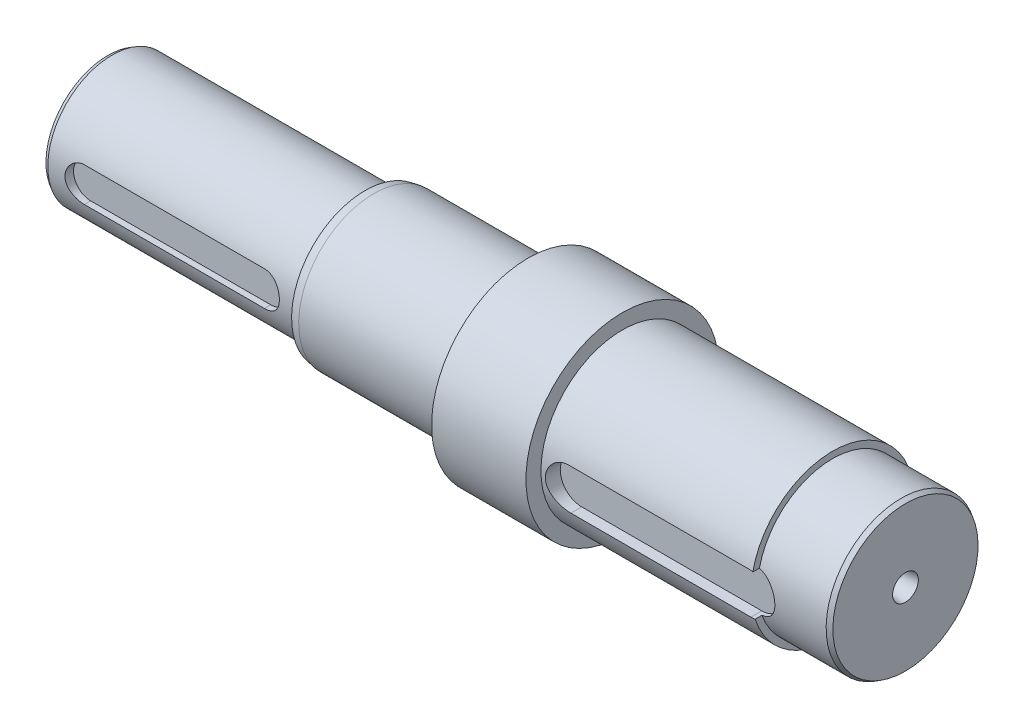
ISO-10303-21;
HEADER;
FILE_DESCRIPTION(('STEP AP214'),'2;1');
FILE_NAME('part.step','',(''),(''),'','','');
FILE_SCHEMA(('AUTOMOTIVE_DESIGN { 1 0 10303 214 1 1 1 1 }'));
ENDSEC;
DATA;
#1=APPLICATION_CONTEXT('core data for automotive mechanical design processes');
#2=APPLICATION_PROTOCOL_DEFINITION('international standard','automotive_design',2000,#1);
#3=PRODUCT_CONTEXT('',#1,'mechanical');
#4=PRODUCT('Part','Part','',(#3));
#5=PRODUCT_RELATED_PRODUCT_CATEGORY('part','',(#4));
#6=PRODUCT_DEFINITION_FORMATION('','',#4);
#7=PRODUCT_DEFINITION_CONTEXT('part definition',#1,'design');
#8=PRODUCT_DEFINITION('design','',#6,#7);
#9=PRODUCT_DEFINITION_SHAPE('','',#8);
#10=(LENGTH_UNIT() NAMED_UNIT(*) SI_UNIT(.MILLI.,.METRE.));
#11=(NAMED_UNIT(*) PLANE_ANGLE_UNIT() SI_UNIT($,.RADIAN.));
#12=(NAMED_UNIT(*) SI_UNIT($,.STERADIAN.) SOLID_ANGLE_UNIT());
#13=UNCERTAINTY_MEASURE_WITH_UNIT(LENGTH_MEASURE(1.E-05),#10,'distance_accuracy_value','');
#14=(GEOMETRIC_REPRESENTATION_CONTEXT(3) GLOBAL_UNCERTAINTY_ASSIGNED_CONTEXT((#13)) GLOBAL_UNIT_ASSIGNED_CONTEXT((#10,
#11,#12)) REPRESENTATION_CONTEXT('',''));
#15=CARTESIAN_POINT('',(0.,0.,0.));
#16=DIRECTION('',(0.,0.,1.));
#17=DIRECTION('',(1.,0.,0.));
#18=AXIS2_PLACEMENT_3D('',#15,#16,#17);
#19=CARTESIAN_POINT('',(-98.6947443181818,0.,0.));
#20=DIRECTION('',(-1.,0.,0.));
#21=DIRECTION('',(0.,-1.,0.));
#22=AXIS2_PLACEMENT_3D('',#19,#20,#21);
#23=CYLINDRICAL_SURFACE('',#22,19.);
#24=CARTESIAN_POINT('',(21.3052556818182,0.,0.));
#25=DIRECTION('',(-1.,0.,0.));
#26=DIRECTION('',(0.,-1.,0.));
#27=AXIS2_PLACEMENT_3D('',#24,#25,#26);
#28=CIRCLE('',#27,19.);
#29=CARTESIAN_POINT('',(21.3052556818182,-19.,0.));
#30=VERTEX_POINT('',#29);
#31=EDGE_CURVE('E221',#30,#30,#28,.T.);
#32=ORIENTED_EDGE('',*,*,#31,.F.);
#33=EDGE_LOOP('',(#32));
#34=FACE_BOUND('',#33,.T.);
#35=CARTESIAN_POINT('',(69.3052556818182,-6.,18.0277563773199));
#36=CARTESIAN_POINT('',(69.3893336137772,-6.00000257579785,18.0277538686261));
#37=CARTESIAN_POINT('',(69.4734109502124,-5.99787928288462,18.0284621960467));
#38=CARTESIAN_POINT('',(69.6410941112768,-5.98941216393533,18.0312777321598));
#39=CARTESIAN_POINT('',(69.7247005969589,-5.98308013219844,18.0333810316365));
#40=CARTESIAN_POINT('',(69.8914432672904,-5.96622654081709,18.0389639161815));
#41=CARTESIAN_POINT('',(69.9745794539085,-5.95570499872395,18.042443495484));
#42=CARTESIAN_POINT('',(70.1403855788294,-5.93047825095381,18.0507504291519));
#43=CARTESIAN_POINT('',(70.2230535613351,-5.9157614200859,18.0555815278892));
#44=CARTESIAN_POINT('',(70.3052556818182,-5.89897948556636,18.061064227472));
#45=B_SPLINE_CURVE_WITH_KNOTS('',3,(#35,#36,#37,#38,#39,#40,#41,#42,#43,#44),.UNSPECIFIED.,.F.,
.F.,(4,2,2,2,4),(0.,0.25220308202243,0.503702369437238,0.755200603245461,1.00740263101469),.UNSPECIFIED.);
#46=CARTESIAN_POINT('',(69.3052556818182,-6.,18.0277563773199));
#47=VERTEX_POINT('',#46);
#48=CARTESIAN_POINT('',(70.3052556818182,-5.89897948556636,18.061064227472));
#49=VERTEX_POINT('',#48);
#50=EDGE_CURVE('E157',#47,#49,#45,.T.);
#51=ORIENTED_EDGE('',*,*,#50,.F.);
#52=DIRECTION('',(-1.,0.,0.));
#53=VECTOR('',#52,1.);
#54=CARTESIAN_POINT('',(-98.6947443181818,-6.00000000000002,18.0277563773199));
#55=LINE('',#54,#53);
#56=CARTESIAN_POINT('',(27.3052556818182,-6.00000000000001,18.0277563773199));
#57=VERTEX_POINT('',#56);
#58=EDGE_CURVE('E11',#57,#47,#55,.F.);
#59=ORIENTED_EDGE('',*,*,#58,.F.);
#60=CARTESIAN_POINT('',(27.3052556818182,4.,18.5741756210067));
#61=CARTESIAN_POINT('',(27.1661588355617,4.00001685790611,18.5741600112581));
#62=CARTESIAN_POINT('',(27.0270668492959,3.99419636407822,18.5754250917841));
#63=CARTESIAN_POINT('',(26.7499123739715,3.97100429542883,18.5804032327995));
#64=CARTESIAN_POINT('',(26.6118497420993,3.95363435432447,18.5841159470605));
#65=CARTESIAN_POINT('',(26.3379596925412,3.90750498724634,18.5938679730531));
#66=CARTESIAN_POINT('',(26.2021289664827,3.8787643764187,18.599903440857));
#67=CARTESIAN_POINT('',(25.9334294927728,3.81012658803463,18.6140852696638));
#68=CARTESIAN_POINT('',(25.8005607696846,3.77022931799554,18.6222316481648));
#69=CARTESIAN_POINT('',(25.5387309163093,3.67959194067003,18.6403523096814));
#70=CARTESIAN_POINT('',(25.4097691111046,3.62885371848746,18.6503262748598));
#71=CARTESIAN_POINT('',(25.1565561159239,3.5168861911782,18.6717637141105));
#72=CARTESIAN_POINT('',(25.0323066930508,3.45565299711485,18.6832277399464));
#73=CARTESIAN_POINT('',(24.7894218707744,3.32316009447191,18.70724822748));
#74=CARTESIAN_POINT('',(24.6707852437518,3.25190259206308,18.7198044485737));
#75=CARTESIAN_POINT('',(24.4398311747954,3.09981313561822,18.7455890141292));
#76=CARTESIAN_POINT('',(24.3275161199046,3.01897760019468,18.7588176089403));
#77=CARTESIAN_POINT('',(24.1084591726865,2.84709562934897,18.7856784758374));
#78=CARTESIAN_POINT('',(24.0018174746677,2.75592194268055,18.7993138071927));
#79=CARTESIAN_POINT('',(23.7965145392649,2.5648848783138,18.8263292407875));
#80=CARTESIAN_POINT('',(23.697856284904,2.46501828116562,18.83970924621));
#81=CARTESIAN_POINT('',(23.5092625617196,2.25731607832725,18.8657221689228));
#82=CARTESIAN_POINT('',(23.4193249713508,2.14948242215148,18.8783552676255));
#83=CARTESIAN_POINT('',(23.2487455886166,1.92650589932029,18.9024112572045));
#84=CARTESIAN_POINT('',(23.1681072084091,1.81136037360076,18.9138337037327));
#85=CARTESIAN_POINT('',(23.016444233856,1.57410151156793,18.9350585921822));
#86=CARTESIAN_POINT('',(22.9454595777229,1.45196203272837,18.9448543391546));
#87=CARTESIAN_POINT('',(22.8139998809385,1.20194817032521,18.9623581755525));
#88=CARTESIAN_POINT('',(22.7535287862505,1.07407165608613,18.9700654817452));
#89=CARTESIAN_POINT('',(22.6436309936326,0.813620796065558,18.983018941704));
#90=CARTESIAN_POINT('',(22.5941980053708,0.681049176070755,18.9882664991014));
#91=CARTESIAN_POINT('',(22.5067077954172,0.412072555065769,18.9960076796387));
#92=CARTESIAN_POINT('',(22.4686546625751,0.275666195423424,18.9985003137834));
#93=CARTESIAN_POINT('',(22.4050086885003,0.00332532392624367,19.0004756607683));
#94=CARTESIAN_POINT('',(22.3791441316395,-0.132544994004049,19.0000277067871));
#95=CARTESIAN_POINT('',(22.3387462777944,-0.405931594277556,18.996156878127));
#96=CARTESIAN_POINT('',(22.3242171152517,-0.543448458626753,18.9927329189496));
#97=CARTESIAN_POINT('',(22.2978459731731,-0.956826743535852,18.9778837397496));
#98=CARTESIAN_POINT('',(22.3031459123931,-1.23383590845484,18.9618839438189));
#99=CARTESIAN_POINT('',(22.3587037515602,-1.77816298014791,18.9185578656315));
#100=CARTESIAN_POINT('',(22.4083161776923,-2.04556288447772,18.8913972134913));
#101=CARTESIAN_POINT('',(22.5497175910413,-2.56780204839454,18.8275219650554));
#102=CARTESIAN_POINT('',(22.6415110524545,-2.8226399723403,18.7908063554322));
#103=CARTESIAN_POINT('',(22.8667906298894,-3.31859365521029,18.7096640756035));
#104=CARTESIAN_POINT('',(23.0011367637862,-3.55929262001249,18.6650876058504));
#105=CARTESIAN_POINT('',(23.3071859900335,-4.01508306300515,18.5723778427754));
#106=CARTESIAN_POINT('',(23.4788971396255,-4.23016900260429,18.52424378379));
#107=CARTESIAN_POINT('',(23.7641729188379,-4.53283270056144,18.4516871772259));
#108=CARTESIAN_POINT('',(23.8658116835602,-4.63185524122231,18.4270310315437));
#109=CARTESIAN_POINT('',(24.0772211521856,-4.8209784548006,18.3784568083451));
#110=CARTESIAN_POINT('',(24.1869889260224,-4.91108231531848,18.3545384692507));
#111=CARTESIAN_POINT('',(24.4140416382409,-5.08179830075215,18.30800831968));
#112=CARTESIAN_POINT('',(24.5313315152465,-5.16240408913632,18.2853973864897));
#113=CARTESIAN_POINT('',(24.7725649691084,-5.31343442569882,18.2420827813708));
#114=CARTESIAN_POINT('',(24.8965057893733,-5.38386314790984,18.2213783287874));
#115=CARTESIAN_POINT('',(25.1500143580722,-5.51388849241055,18.1824540132713));
#116=CARTESIAN_POINT('',(25.2795708081468,-5.57350571804406,18.1642294413722));
#117=CARTESIAN_POINT('',(25.5435799333096,-5.68154152780717,18.1307276669599));
#118=CARTESIAN_POINT('',(25.6780304925471,-5.72996488631752,18.1154492083404));
#119=CARTESIAN_POINT('',(25.9507311381165,-5.81514740001102,18.0882851610722));
#120=CARTESIAN_POINT('',(26.0889764023809,-5.8519206757604,18.0763954668159));
#121=CARTESIAN_POINT('',(26.3683103817105,-5.91350936696553,18.0563411568545));
#122=CARTESIAN_POINT('',(26.5093976166186,-5.93833084755597,18.0481746518681));
#123=CARTESIAN_POINT('',(26.7597372799549,-5.97135409342011,18.0372714846592));
#124=CARTESIAN_POINT('',(26.8686256574078,-5.98209833155677,18.0337073612855));
#125=CARTESIAN_POINT('',(27.0867575404689,-5.99641894645898,18.0289481698325));
#126=CARTESIAN_POINT('',(27.1960002545829,-6.00000619483549,18.027749508599));
#127=CARTESIAN_POINT('',(27.3052556818182,-6.00000000000001,18.0277563773199));
#128=B_SPLINE_CURVE_WITH_KNOTS('',3,(#60,#61,#62,#63,#64,#65,#66,#67,#68,#69,#70,#71,#72,#73,
#74,#75,#76,#77,#78,#79,#80,#81,#82,#83,#84,#85,#86,#87,#88,#89,#90,#91,#92,#93,#94,#95,#96,#97,
#98,#99,#100,#101,#102,#103,#104,#105,#106,#107,#108,#109,#110,#111,#112,#113,#114,#115,#116,
#117,#118,#119,#120,#121,#122,#123,#124,#125,#126,#127),.UNSPECIFIED.,.F.,.F.,(4,2,2,2,2,2,2,2,
2,2,2,2,2,2,2,2,2,2,2,2,2,2,2,2,2,2,2,2,2,2,2,2,2,4),(0.,0.417155703360219,0.83425241086853,
1.25066181223549,1.66707466551285,2.08341516872838,2.49991028277247,2.91631387668676,
3.33287366519065,3.75527275642223,4.17782895570663,4.60028209709407,5.02288975922486,
5.44719579535117,5.87166074038484,6.29588317293423,6.72025784849242,7.13466315414948,
7.54921953832579,8.37735934129406,9.19362936925819,10.0099860000209,10.8440253568034,
11.6782447410098,12.109905715731,12.541411850378,12.9732042488684,13.404819045831,
13.8356024720572,14.2662018211839,14.6962772446434,15.1261341886513,15.4543095697214,
15.7819860651025),.UNSPECIFIED.);
#129=CARTESIAN_POINT('',(27.3052556818182,4.,18.5741756210067));
#130=VERTEX_POINT('',#129);
#131=EDGE_CURVE('E47',#130,#57,#128,.T.);
#132=ORIENTED_EDGE('',*,*,#131,.F.);
#133=DIRECTION('',(-1.,0.,0.));
#134=VECTOR('',#133,1.);
#135=CARTESIAN_POINT('',(-98.6947443181818,4.,18.5741756210067));
#136=LINE('',#135,#134);
#137=CARTESIAN_POINT('',(69.3052556818182,4.,18.5741756210067));
#138=VERTEX_POINT('',#137);
#139=EDGE_CURVE('E193',#138,#130,#136,.T.);
#140=ORIENTED_EDGE('',*,*,#139,.F.);
#141=CARTESIAN_POINT('',(70.3052556818182,3.89897948556636,18.5956435481844));
#142=CARTESIAN_POINT('',(70.2229914190767,3.91577369985261,18.5921208784416));
#143=CARTESIAN_POINT('',(70.1402860580984,3.93049531779535,18.5890118170965));
#144=CARTESIAN_POINT('',(69.9744308025277,3.9557256942336,18.5836598394075));
#145=CARTESIAN_POINT('',(69.8912826544848,3.96624545591318,18.5814146614306));
#146=CARTESIAN_POINT('',(69.7245432999553,3.98309334490757,18.5778104735184));
#147=CARTESIAN_POINT('',(69.6409520925734,3.989421463748,18.5764514653746));
#148=CARTESIAN_POINT('',(69.4733263351619,3.9978814165179,18.5746318650875));
#149=CARTESIAN_POINT('',(69.3892911972997,4.00000211524297,18.5741736569977));
#150=CARTESIAN_POINT('',(69.3052556818182,4.,18.5741756210067));
#151=B_SPLINE_CURVE_WITH_KNOTS('',3,(#141,#142,#143,#144,#145,#146,#147,#148,#149,#150),
.UNSPECIFIED.,.F.,.F.,(4,2,2,2,4),(0.,0.25207744543739,0.503490391583757,0.754903846018369,
1.00698179920828),.UNSPECIFIED.);
#152=CARTESIAN_POINT('',(70.3052556818182,3.89897948556635,18.5956435481844));
#153=VERTEX_POINT('',#152);
#154=EDGE_CURVE('E165',#153,#138,#151,.T.);
#155=ORIENTED_EDGE('',*,*,#154,.F.);
#156=CARTESIAN_POINT('',(70.3052556818182,0.,0.));
#157=DIRECTION('',(-1.,0.,0.));
#158=DIRECTION('',(0.,-1.,0.));
#159=AXIS2_PLACEMENT_3D('',#156,#157,#158);
#160=CIRCLE('',#159,19.);
#161=EDGE_CURVE('E216',#153,#49,#160,.T.);
#162=ORIENTED_EDGE('',*,*,#161,.T.);
#163=EDGE_LOOP('',(#51,#59,#132,#140,#155,#162));
#164=FACE_BOUND('',#163,.T.);
#165=ADVANCED_FACE('F39',(#34,#164),#23,.T.);
#166=CARTESIAN_POINT('',(70.3052556818182,19.,0.));
#167=DIRECTION('',(-1.,0.,0.));
#168=DIRECTION('',(0.,-1.,0.));
#169=AXIS2_PLACEMENT_3D('',#166,#167,#168);
#170=PLANE('',#169);
#171=DIRECTION('',(0.,0.,-1.));
#172=VECTOR('',#171,1.);
#173=CARTESIAN_POINT('',(70.3052556818182,3.89897948556635,40.5));
#174=LINE('',#173,#172);
#175=CARTESIAN_POINT('',(70.3052556818182,3.89897948556636,17.060127753658));
#176=VERTEX_POINT('',#175);
#177=EDGE_CURVE('E155',#176,#153,#174,.F.);
#178=ORIENTED_EDGE('',*,*,#177,.F.);
#179=CARTESIAN_POINT('',(70.3052556818182,0.,0.));
#180=DIRECTION('',(-1.,0.,0.));
#181=DIRECTION('',(0.,-1.,0.));
#182=AXIS2_PLACEMENT_3D('',#179,#180,#181);
#183=CIRCLE('',#182,17.5);
#184=CARTESIAN_POINT('',(70.3052556818182,-5.89897948556636,16.4758016809158));
#185=VERTEX_POINT('',#184);
#186=EDGE_CURVE('E214',#176,#185,#183,.T.);
#187=ORIENTED_EDGE('',*,*,#186,.T.);
#188=DIRECTION('',(0.,0.,-1.));
#189=VECTOR('',#188,1.);
#190=CARTESIAN_POINT('',(70.3052556818182,-5.89897948556636,40.5));
#191=LINE('',#190,#189);
#192=EDGE_CURVE('E54',#49,#185,#191,.T.);
#193=ORIENTED_EDGE('',*,*,#192,.F.);
#194=ORIENTED_EDGE('',*,*,#161,.F.);
#195=EDGE_LOOP('',(#178,#187,#193,#194));
#196=FACE_BOUND('',#195,.T.);
#197=ADVANCED_FACE('F200',(#196),#170,.F.);
#198=CARTESIAN_POINT('',(-98.6947443181818,0.,0.));
#199=DIRECTION('',(-1.,0.,0.));
#200=DIRECTION('',(0.,-1.,0.));
#201=AXIS2_PLACEMENT_3D('',#198,#199,#200);
#202=CYLINDRICAL_SURFACE('',#201,17.5);
#203=CARTESIAN_POINT('',(86.3052556818182,0.,0.));
#204=DIRECTION('',(-1.,0.,0.));
#205=DIRECTION('',(0.,-1.,0.));
#206=AXIS2_PLACEMENT_3D('',#203,#204,#205);
#207=CIRCLE('',#206,17.5);
#208=CARTESIAN_POINT('',(86.3052556818182,-17.5,0.));
#209=VERTEX_POINT('',#208);
#210=EDGE_CURVE('E219',#209,#209,#207,.T.);
#211=ORIENTED_EDGE('',*,*,#210,.T.);
#212=EDGE_LOOP('',(#211));
#213=FACE_BOUND('',#212,.T.);
#214=CARTESIAN_POINT('',(70.3052556818182,-5.89897948556636,16.4758016809158));
#215=CARTESIAN_POINT('',(70.4422014235865,-5.87104158280583,16.4857938368412));
#216=CARTESIAN_POINT('',(70.5778062090224,-5.83736458335083,16.4977819742232));
#217=CARTESIAN_POINT('',(70.8453513704898,-5.7589378971628,16.525327642576));
#218=CARTESIAN_POINT('',(70.9772930806551,-5.71419230217784,16.5408838543758));
#219=CARTESIAN_POINT('',(71.2363092666309,-5.61413742281593,16.5751084425126));
#220=CARTESIAN_POINT('',(71.3633950414352,-5.5588547133859,16.5937689749038));
#221=CARTESIAN_POINT('',(71.6121933669906,-5.4381504770382,16.6337177920808));
#222=CARTESIAN_POINT('',(71.7339055204764,-5.37272820212226,16.6550062707072));
#223=CARTESIAN_POINT('',(72.0895755790142,-5.1621247490769,16.7219658519324));
#224=CARTESIAN_POINT('',(72.3145591255714,-5.00241557860577,16.770799283362));
#225=CARTESIAN_POINT('',(72.7348045225255,-4.64880533293169,16.8722376613124));
#226=CARTESIAN_POINT('',(72.9300488435057,-4.45488423614819,16.9248448055373));
#227=CARTESIAN_POINT('',(73.2925231593311,-4.03022329245111,17.0310530666383));
#228=CARTESIAN_POINT('',(73.4585377539331,-3.79843473009262,17.0846248041592));
#229=CARTESIAN_POINT('',(73.7492392435792,-3.30911102326949,17.1861031334646));
#230=CARTESIAN_POINT('',(73.8739283812524,-3.05157727691915,17.2340100325749));
#231=CARTESIAN_POINT('',(74.0776626460808,-2.51832911187605,17.3199498548401));
#232=CARTESIAN_POINT('',(74.1568415086837,-2.24267064225071,17.3580115257764));
#233=CARTESIAN_POINT('',(74.2670006855671,-1.6804877095761,17.4214195883933));
#234=CARTESIAN_POINT('',(74.2979959293384,-1.39396664045549,17.4467699169797));
#235=CARTESIAN_POINT('',(74.3099951294051,-0.830840888962415,17.4824494802286));
#236=CARTESIAN_POINT('',(74.2930075811567,-0.554314427511014,17.4933549532067));
#237=CARTESIAN_POINT('',(74.2135697668175,-0.00767373769400769,17.5021328889064));
#238=CARTESIAN_POINT('',(74.1511233239707,0.262441027943896,17.5000064475437));
#239=CARTESIAN_POINT('',(73.9842642423364,0.78333623944141,17.4843667931143));
#240=CARTESIAN_POINT('',(73.8806671966871,1.03438564208787,17.4710695820959));
#241=CARTESIAN_POINT('',(73.6345829557875,1.51595798259878,17.4358888564706));
#242=CARTESIAN_POINT('',(73.4920944205833,1.74648021286406,17.4140050460126));
#243=CARTESIAN_POINT('',(73.1687234266794,2.18585505298461,17.3643900418286));
#244=CARTESIAN_POINT('',(72.9870772578565,2.39413118215712,17.3365426208009));
#245=CARTESIAN_POINT('',(72.5919137866481,2.778057524818,17.2791830555566));
#246=CARTESIAN_POINT('',(72.3783767818507,2.95368741756846,17.2496698892911));
#247=CARTESIAN_POINT('',(72.0357784325211,3.19097729667391,17.2068113776963));
#248=CARTESIAN_POINT('',(71.9161943452522,3.26649934856451,17.1925891162046));
#249=CARTESIAN_POINT('',(71.6709771084046,3.40718812407574,17.1652614498825));
#250=CARTESIAN_POINT('',(71.545346276576,3.47235877489899,17.152155622369));
#251=CARTESIAN_POINT('',(71.2891102146192,3.5917621185911,17.1275496855757));
#252=CARTESIAN_POINT('',(71.1585136050618,3.64601282245325,17.1160469420271));
#253=CARTESIAN_POINT('',(70.8931074906153,3.74327702477922,17.095038915515));
#254=CARTESIAN_POINT('',(70.7583006648387,3.786297512641,17.0855323908804));
#255=CARTESIAN_POINT('',(70.5695296425506,3.83782610040693,17.0739948910885));
#256=CARTESIAN_POINT('',(70.5169333519532,3.85126647565092,17.0709669665732));
#257=CARTESIAN_POINT('',(70.4113733984023,3.87641693581377,17.0652734401522));
#258=CARTESIAN_POINT('',(70.3584102279266,3.88812899432618,17.0626074252591));
#259=CARTESIAN_POINT('',(70.3052556818182,3.89897948556636,17.060127753658));
#260=B_SPLINE_CURVE_WITH_KNOTS('',3,(#214,#215,#216,#217,#218,#219,#220,#221,#222,#223,#224,
#225,#226,#227,#228,#229,#230,#231,#232,#233,#234,#235,#236,#237,#238,#239,#240,#241,#242,#243,
#244,#245,#246,#247,#248,#249,#250,#251,#252,#253,#254,#255,#256,#257,#258,#259),.UNSPECIFIED.,
.F.,.F.,(4,2,2,2,2,2,2,2,2,2,2,2,2,2,2,2,2,2,2,2,2,2,4),(0.,0.42019614302979,0.8402371829081,
1.25923255684747,1.67825885490482,2.51473419832261,3.35170069945859,4.21787513515948,
5.08400255804034,5.94757161231429,6.81087303999669,7.63857975106979,8.46621685729873,
9.27820927821311,10.0902296787685,10.9198119088954,11.7499087980923,12.1759330899275,
12.6017953649769,13.026949375328,13.4518381464546,13.614927128986,13.7778284119125),.UNSPECIFIED.);
#261=EDGE_CURVE('E185',#185,#176,#260,.T.);
#262=ORIENTED_EDGE('',*,*,#261,.F.);
#263=ORIENTED_EDGE('',*,*,#186,.F.);
#264=EDGE_LOOP('',(#262,#263));
#265=FACE_BOUND('',#264,.T.);
#266=ADVANCED_FACE('F196',(#213,#265),#202,.T.);
#267=CARTESIAN_POINT('',(-98.6947443181818,0.,0.));
#268=DIRECTION('',(1.,0.,0.));
#269=DIRECTION('',(0.,1.,0.));
#270=AXIS2_PLACEMENT_3D('',#267,#268,#269);
#271=PLANE('',#270);
#272=CARTESIAN_POINT('',(-98.6947443181818,0.,0.));
#273=DIRECTION('',(-1.,0.,0.));
#274=DIRECTION('',(0.,0.,1.));
#275=AXIS2_PLACEMENT_3D('',#272,#273,#274);
#276=CIRCLE('',#275,3.);
#277=CARTESIAN_POINT('',(-98.6947443181818,0.,3.));
#278=VERTEX_POINT('',#277);
#279=EDGE_CURVE('E143',#278,#278,#276,.T.);
#280=ORIENTED_EDGE('',*,*,#279,.F.);
#281=EDGE_LOOP('',(#280));
#282=FACE_BOUND('',#281,.T.);
#283=CARTESIAN_POINT('',(-98.6947443181818,0.,0.));
#284=DIRECTION('',(-1.,0.,0.));
#285=DIRECTION('',(0.,-1.,0.));
#286=AXIS2_PLACEMENT_3D('',#283,#284,#285);
#287=CIRCLE('',#286,14.4226497308104);
#288=CARTESIAN_POINT('',(-98.6947443181818,-14.4226497308104,0.));
#289=VERTEX_POINT('',#288);
#290=EDGE_CURVE('E251',#289,#289,#287,.T.);
#291=ORIENTED_EDGE('',*,*,#290,.T.);
#292=EDGE_LOOP('',(#291));
#293=FACE_BOUND('',#292,.T.);
#294=ADVANCED_FACE('F41',(#282,#293),#271,.F.);
#295=CARTESIAN_POINT('',(-97.6947443181818,0.,0.));
#296=DIRECTION('',(1.,0.,0.));
#297=DIRECTION('',(0.,1.,0.));
#298=AXIS2_PLACEMENT_3D('',#295,#296,#297);
#299=CONICAL_SURFACE('',#298,15.,0.523598775598294);
#300=ORIENTED_EDGE('',*,*,#290,.F.);
#301=EDGE_LOOP('',(#300));
#302=FACE_BOUND('',#301,.T.);
#303=CARTESIAN_POINT('',(-97.6947443181818,0.,0.));
#304=DIRECTION('',(-1.,0.,0.));
#305=DIRECTION('',(0.,-1.,0.));
#306=AXIS2_PLACEMENT_3D('',#303,#304,#305);
#307=CIRCLE('',#306,15.);
#308=CARTESIAN_POINT('',(-97.6947443181818,-15.,0.));
#309=VERTEX_POINT('',#308);
#310=EDGE_CURVE('E248',#309,#309,#307,.T.);
#311=ORIENTED_EDGE('',*,*,#310,.T.);
#312=EDGE_LOOP('',(#311));
#313=FACE_BOUND('',#312,.T.);
#314=ADVANCED_FACE('F524',(#302,#313),#299,.T.);
#315=CARTESIAN_POINT('',(-98.6947443181818,0.,0.));
#316=DIRECTION('',(-1.,0.,0.));
#317=DIRECTION('',(0.,-1.,0.));
#318=AXIS2_PLACEMENT_3D('',#315,#316,#317);
#319=CYLINDRICAL_SURFACE('',#318,15.);
#320=DIRECTION('',(-1.,0.,0.));
#321=VECTOR('',#320,1.);
#322=CARTESIAN_POINT('',(-98.6947443181818,4.05,14.4429048324774));
#323=LINE('',#322,#321);
#324=CARTESIAN_POINT('',(-89.6949943244321,4.05,14.4429048324774));
#325=VERTEX_POINT('',#324);
#326=CARTESIAN_POINT('',(-47.6949943244321,4.05,14.4429048324774));
#327=VERTEX_POINT('',#326);
#328=EDGE_CURVE('E194',#325,#327,#323,.F.);
#329=ORIENTED_EDGE('',*,*,#328,.T.);
#330=CARTESIAN_POINT('',(-47.6949943244321,4.05,14.4429048324774));
#331=CARTESIAN_POINT('',(-47.5846997477293,4.05001314932835,14.4428914531416));
#332=CARTESIAN_POINT('',(-47.4744131914482,4.04543838343753,14.4441837348867));
#333=CARTESIAN_POINT('',(-47.2546709190222,4.02721520252342,14.4492803029022));
#334=CARTESIAN_POINT('',(-47.1452150501282,4.0135684986714,14.4530841154405));
#335=CARTESIAN_POINT('',(-46.928143794945,3.97734310954755,14.4630935668311));
#336=CARTESIAN_POINT('',(-46.8205249144209,3.95478397510367,14.4692939477908));
#337=CARTESIAN_POINT('',(-46.6076726039614,3.90094781248267,14.4839006615935));
#338=CARTESIAN_POINT('',(-46.5024392173865,3.86967062597704,14.4923070344993));
#339=CARTESIAN_POINT('',(-46.1914524801284,3.76312039874318,14.520481905317));
#340=CARTESIAN_POINT('',(-45.9901734684474,3.67508839827319,14.5432179927643));
#341=CARTESIAN_POINT('',(-45.6052713213284,3.46774036351877,14.5940433272455));
#342=CARTESIAN_POINT('',(-45.4216542257129,3.34841367904936,14.6221343957923));
#343=CARTESIAN_POINT('',(-45.0725287236542,3.07860062797752,14.6813380085674));
#344=CARTESIAN_POINT('',(-44.9075328855361,2.92746174248031,14.712505117145));
#345=CARTESIAN_POINT('',(-44.6048952822841,2.59971826180473,14.7739372114001));
#346=CARTESIAN_POINT('',(-44.4672580500431,2.42310945500931,14.80420204688));
#347=CARTESIAN_POINT('',(-44.2210220173583,2.04577090213696,14.8610826567499));
#348=CARTESIAN_POINT('',(-44.1129513896761,1.84468497104367,14.8876283797533));
#349=CARTESIAN_POINT('',(-43.9323561485762,1.42638100006763,14.933507203252));
#350=CARTESIAN_POINT('',(-43.8598239355859,1.20916642060275,14.9528418455612));
#351=CARTESIAN_POINT('',(-43.7539982774669,0.769998987770738,14.9818024753968));
#352=CARTESIAN_POINT('',(-43.7198496378767,0.548266373593781,14.991639340818));
#353=CARTESIAN_POINT('',(-43.6890865455694,0.102007694107047,15.0013122252984));
#354=CARTESIAN_POINT('',(-43.6924664654076,-0.12251794734203,15.0011497437529));
#355=CARTESIAN_POINT('',(-43.7360637150396,-0.561836272125196,14.9910440763006));
#356=CARTESIAN_POINT('',(-43.7753264864697,-0.776730516666958,14.9813538441343));
#357=CARTESIAN_POINT('',(-43.8880483225557,-1.19677824163868,14.9536634965668));
#358=CARTESIAN_POINT('',(-43.961508873251,-1.40193129834548,14.9356630200504));
#359=CARTESIAN_POINT('',(-44.1411856212776,-1.79887891896252,14.8930952179381));
#360=CARTESIAN_POINT('',(-44.2476960007313,-1.99053373981751,14.8684691899504));
#361=CARTESIAN_POINT('',(-44.4902312748503,-2.35357241200658,14.815343600434));
#362=CARTESIAN_POINT('',(-44.6262612454268,-2.52495276929401,14.7868433730496));
#363=CARTESIAN_POINT('',(-44.928802052102,-2.84804378152094,14.7280839415426));
#364=CARTESIAN_POINT('',(-45.0961114589975,-2.99900125281122,14.6977976063593));
#365=CARTESIAN_POINT('',(-45.4541195482725,-3.27098665386637,14.6396741951286));
#366=CARTESIAN_POINT('',(-45.6448247074989,-3.39200626758043,14.6118378009988));
#367=CARTESIAN_POINT('',(-45.9450614658603,-3.5487034743883,14.5742788266461));
#368=CARTESIAN_POINT('',(-46.0479550213561,-3.59694321455739,14.5624185516133));
#369=CARTESIAN_POINT('',(-46.257624424596,-3.68454849690777,14.5405001757957));
#370=CARTESIAN_POINT('',(-46.364398696013,-3.72391759653176,14.5304413528977));
#371=CARTESIAN_POINT('',(-46.5809578932996,-3.79341619513013,14.5124526603179));
#372=CARTESIAN_POINT('',(-46.690739597394,-3.82355519045504,14.5045206035759));
#373=CARTESIAN_POINT('',(-46.9125692383247,-3.87437884692583,14.4910275298853));
#374=CARTESIAN_POINT('',(-47.0246160990592,-3.89506789211278,14.4854654135495));
#375=CARTESIAN_POINT('',(-47.2297426975407,-3.9239452580717,14.4776670002862));
#376=CARTESIAN_POINT('',(-47.3225869034219,-3.93371790835049,14.4750110835216));
#377=CARTESIAN_POINT('',(-47.5086163217992,-3.94674315810015,14.4714625099462));
#378=CARTESIAN_POINT('',(-47.6018007575161,-3.95000609830929,14.4705670566548));
#379=CARTESIAN_POINT('',(-47.6949943244321,-3.95,14.4705735891844));
#380=B_SPLINE_CURVE_WITH_KNOTS('',3,(#330,#331,#332,#333,#334,#335,#336,#337,#338,#339,#340,
#341,#342,#343,#344,#345,#346,#347,#348,#349,#350,#351,#352,#353,#354,#355,#356,#357,#358,#359,
#360,#361,#362,#363,#364,#365,#366,#367,#368,#369,#370,#371,#372,#373,#374,#375,#376,#377,#378,
#379),.UNSPECIFIED.,.F.,.F.,(4,2,2,2,2,2,2,2,2,2,2,2,2,2,2,2,2,2,2,2,2,2,2,2,4),(0.,
0.330767559860521,0.661472747225656,0.991456473029354,1.32144619205658,1.98070655532681,
2.64019156941839,3.31481828339097,3.98955667945485,4.6756603477153,5.36161723473287,
6.03196760153311,6.70221744998884,7.35514038411232,8.00809169317285,8.66703035908604,
9.32608241979886,10.0051004484003,10.6843068813916,11.0267300277705,11.3690156048867,
11.7109478307272,12.0527212651184,12.3326683259177,12.612170332854),.UNSPECIFIED.);
#381=CARTESIAN_POINT('',(-47.6949943244321,-3.95,14.4705735891844));
#382=VERTEX_POINT('',#381);
#383=EDGE_CURVE('E254',#327,#382,#380,.T.);
#384=ORIENTED_EDGE('',*,*,#383,.T.);
#385=DIRECTION('',(-1.,0.,0.));
#386=VECTOR('',#385,1.);
#387=CARTESIAN_POINT('',(-98.6947443181818,-3.95,14.4705735891844));
#388=LINE('',#387,#386);
#389=CARTESIAN_POINT('',(-89.6949943244321,-3.95,14.4705735891844));
#390=VERTEX_POINT('',#389);
#391=EDGE_CURVE('E595',#382,#390,#388,.T.);
#392=ORIENTED_EDGE('',*,*,#391,.T.);
#393=CARTESIAN_POINT('',(-89.6949943244321,-3.95,14.4705735891844));
#394=CARTESIAN_POINT('',(-89.805415267959,-3.95001303904781,14.4705603466598));
#395=CARTESIAN_POINT('',(-89.915828301707,-3.94542791663848,14.4718213792457));
#396=CARTESIAN_POINT('',(-90.1358243562103,-3.92716267546555,14.4767937411863));
#397=CARTESIAN_POINT('',(-90.2454075250611,-3.9134842200962,14.4805046224024));
#398=CARTESIAN_POINT('',(-90.4627402973907,-3.87717205422691,14.4902681476818));
#399=CARTESIAN_POINT('',(-90.5704932918563,-3.85455736624302,14.4963158168336));
#400=CARTESIAN_POINT('',(-90.7836125491334,-3.80058567925737,14.5105589710535));
#401=CARTESIAN_POINT('',(-90.8889787714037,-3.76922853187783,14.5187544925752));
#402=CARTESIAN_POINT('',(-91.2003656098237,-3.66239764415952,14.5462133613392));
#403=CARTESIAN_POINT('',(-91.4019076901177,-3.57412510456931,14.568360280493));
#404=CARTESIAN_POINT('',(-91.7872935381685,-3.36618624069412,14.6178021665343));
#405=CARTESIAN_POINT('',(-91.9711316109895,-3.24650986038596,14.6450987816503));
#406=CARTESIAN_POINT('',(-92.3204465324806,-2.97602458760474,14.7024747489679));
#407=CARTESIAN_POINT('',(-92.485432551847,-2.8245907541581,14.7326019842892));
#408=CARTESIAN_POINT('',(-92.7879855558253,-2.49622632538352,14.7917761734206));
#409=CARTESIAN_POINT('',(-92.9255481810423,-2.31929168397725,14.8208229548788));
#410=CARTESIAN_POINT('',(-93.1713433938814,-1.94161006894435,14.875047511748));
#411=CARTESIAN_POINT('',(-93.279098414442,-1.740542044438,14.9001597718332));
#412=CARTESIAN_POINT('',(-93.4590852886786,-1.32237266426094,14.9430731886869));
#413=CARTESIAN_POINT('',(-93.5313248746466,-1.10527481039593,14.9608759367167));
#414=CARTESIAN_POINT('',(-93.6366091541862,-0.666513988142764,14.986758215635));
#415=CARTESIAN_POINT('',(-93.6705181402863,-0.445071278047483,14.9950522172313));
#416=CARTESIAN_POINT('',(-93.7009143794402,0.00050379744156629,15.0016535979861));
#417=CARTESIAN_POINT('',(-93.6974069223575,0.224635778156156,14.9999623888492));
#418=CARTESIAN_POINT('',(-93.6536774764084,0.663389425412553,14.9868920476199));
#419=CARTESIAN_POINT('',(-93.6143606875398,0.878109414086741,14.97575223538));
#420=CARTESIAN_POINT('',(-93.5016061605126,1.29776651348586,14.9452364507469));
#421=CARTESIAN_POINT('',(-93.4281666707136,1.50270312139923,14.925860055545));
#422=CARTESIAN_POINT('',(-93.2484741467948,1.89952428370816,14.8805965280914));
#423=CARTESIAN_POINT('',(-93.1418774269733,2.09124516575737,14.8546417564097));
#424=CARTESIAN_POINT('',(-92.8991524354102,2.45438761022799,14.7989789786518));
#425=CARTESIAN_POINT('',(-92.7630189143036,2.62580555597113,14.769270305814));
#426=CARTESIAN_POINT('',(-92.4601490910733,2.94905202268996,14.7081955001466));
#427=CARTESIAN_POINT('',(-92.2925971944321,3.10011162656641,14.6768065175409));
#428=CARTESIAN_POINT('',(-91.9340323322728,3.37224311709901,14.6166846387948));
#429=CARTESIAN_POINT('',(-91.7430129253904,3.49330674282487,14.5879524757084));
#430=CARTESIAN_POINT('',(-91.4423487786559,3.64995767579956,14.5492512977964));
#431=CARTESIAN_POINT('',(-91.3393709309477,3.69814646798862,14.5370474779563));
#432=CARTESIAN_POINT('',(-91.1295251587793,3.78564178657531,14.5145086483375));
#433=CARTESIAN_POINT('',(-91.0226588248599,3.82495189831087,14.5041728845491));
#434=CARTESIAN_POINT('',(-90.8059117058341,3.89432092828001,14.4857016758342));
#435=CARTESIAN_POINT('',(-90.6960342126686,3.92438954225235,14.4775639259504));
#436=CARTESIAN_POINT('',(-90.4740105651904,3.9750591680017,14.4637337311658));
#437=CARTESIAN_POINT('',(-90.3618654994003,3.99566461486997,14.4580401408456));
#438=CARTESIAN_POINT('',(-90.1572332570576,4.02428258980072,14.4500980430201));
#439=CARTESIAN_POINT('',(-90.0649881032112,4.03392866160249,14.4474046142617));
#440=CARTESIAN_POINT('',(-89.8801626650954,4.04678527917689,14.443806200118));
#441=CARTESIAN_POINT('',(-89.7875831412094,4.05000597509722,14.4428983940219));
#442=CARTESIAN_POINT('',(-89.694994324432,4.05,14.4429048324774));
#443=B_SPLINE_CURVE_WITH_KNOTS('',3,(#393,#394,#395,#396,#397,#398,#399,#400,#401,#402,#403,
#404,#405,#406,#407,#408,#409,#410,#411,#412,#413,#414,#415,#416,#417,#418,#419,#420,#421,#422,
#423,#424,#425,#426,#427,#428,#429,#430,#431,#432,#433,#434,#435,#436,#437,#438,#439,#440,#441,
#442),.UNSPECIFIED.,.F.,.F.,(4,2,2,2,2,2,2,2,2,2,2,2,2,2,2,2,2,2,2,2,2,2,2,2,4),(0.,
0.331146881189805,0.662233204132018,0.992618509392392,1.32300942232211,1.98308961209547,
2.64338142881949,3.31814733140883,3.99302041363854,4.67815092271519,5.36313220152097,
6.03233934206752,6.70145187267409,7.35410605000504,8.00679373411155,8.66648583673614,
9.32629527790981,10.0064913509698,10.686874543189,11.0295681911503,11.3721232061201,
11.7143175921316,12.0563514382325,12.3344795296305,12.6121679138904),.UNSPECIFIED.);
#444=EDGE_CURVE('E62',#390,#325,#443,.T.);
#445=ORIENTED_EDGE('',*,*,#444,.T.);
#446=EDGE_LOOP('',(#329,#384,#392,#445));
#447=FACE_BOUND('',#446,.T.);
#448=ORIENTED_EDGE('',*,*,#310,.F.);
#449=EDGE_LOOP('',(#448));
#450=FACE_BOUND('',#449,.T.);
#451=CARTESIAN_POINT('',(-38.6947443181818,0.,0.));
#452=DIRECTION('',(-1.,0.,0.));
#453=DIRECTION('',(0.,-1.,0.));
#454=AXIS2_PLACEMENT_3D('',#451,#452,#453);
#455=CIRCLE('',#454,15.);
#456=CARTESIAN_POINT('',(-38.6947443181818,-15.,0.));
#457=VERTEX_POINT('',#456);
#458=EDGE_CURVE('E245',#457,#457,#455,.T.);
#459=ORIENTED_EDGE('',*,*,#458,.T.);
#460=EDGE_LOOP('',(#459));
#461=FACE_BOUND('',#460,.T.);
#462=ADVANCED_FACE('F268',(#447,#450,#461),#319,.T.);
#463=CARTESIAN_POINT('',(-38.6947443181818,15.,0.));
#464=DIRECTION('',(1.,0.,0.));
#465=DIRECTION('',(0.,1.,0.));
#466=AXIS2_PLACEMENT_3D('',#463,#464,#465);
#467=PLANE('',#466);
#468=ORIENTED_EDGE('',*,*,#458,.F.);
#469=EDGE_LOOP('',(#468));
#470=FACE_BOUND('',#469,.T.);
#471=CARTESIAN_POINT('',(-38.6947443181818,0.,0.));
#472=DIRECTION('',(-1.,0.,0.));
#473=DIRECTION('',(0.,-1.,0.));
#474=AXIS2_PLACEMENT_3D('',#471,#472,#473);
#475=CIRCLE('',#474,17.1473460385831);
#476=CARTESIAN_POINT('',(-38.6947443181818,-17.1473460385831,0.));
#477=VERTEX_POINT('',#476);
#478=EDGE_CURVE('E242',#477,#477,#475,.T.);
#479=ORIENTED_EDGE('',*,*,#478,.T.);
#480=EDGE_LOOP('',(#479));
#481=FACE_BOUND('',#480,.T.);
#482=ADVANCED_FACE('F508',(#470,#481),#467,.F.);
#483=CARTESIAN_POINT('',(-36.6947443181818,0.,0.));
#484=DIRECTION('',(1.,0.,0.));
#485=DIRECTION('',(0.,1.,0.));
#486=AXIS2_PLACEMENT_3D('',#483,#484,#485);
#487=CONICAL_SURFACE('',#486,17.5,0.174532925199424);
#488=ORIENTED_EDGE('',*,*,#478,.F.);
#489=EDGE_LOOP('',(#488));
#490=FACE_BOUND('',#489,.T.);
#491=CARTESIAN_POINT('',(-36.6947443181818,0.,0.));
#492=DIRECTION('',(-1.,0.,0.));
#493=DIRECTION('',(0.,-1.,0.));
#494=AXIS2_PLACEMENT_3D('',#491,#492,#493);
#495=CIRCLE('',#494,17.5);
#496=CARTESIAN_POINT('',(-36.6947443181818,-17.5,0.));
#497=VERTEX_POINT('',#496);
#498=EDGE_CURVE('E239',#497,#497,#495,.T.);
#499=ORIENTED_EDGE('',*,*,#498,.T.);
#500=EDGE_LOOP('',(#499));
#501=FACE_BOUND('',#500,.T.);
#502=ADVANCED_FACE('F499',(#490,#501),#487,.T.);
#503=CARTESIAN_POINT('',(-98.6947443181818,0.,0.));
#504=DIRECTION('',(-1.,0.,0.));
#505=DIRECTION('',(0.,-1.,0.));
#506=AXIS2_PLACEMENT_3D('',#503,#504,#505);
#507=CYLINDRICAL_SURFACE('',#506,17.5);
#508=ORIENTED_EDGE('',*,*,#498,.F.);
#509=EDGE_LOOP('',(#508));
#510=FACE_BOUND('',#509,.T.);
#511=CARTESIAN_POINT('',(-0.694744318181797,0.,0.));
#512=DIRECTION('',(-1.,0.,0.));
#513=DIRECTION('',(0.,-1.,0.));
#514=AXIS2_PLACEMENT_3D('',#511,#512,#513);
#515=CIRCLE('',#514,17.5);
#516=CARTESIAN_POINT('',(-0.694744318181797,-17.5,0.));
#517=VERTEX_POINT('',#516);
#518=EDGE_CURVE('E236',#517,#517,#515,.T.);
#519=ORIENTED_EDGE('',*,*,#518,.T.);
#520=EDGE_LOOP('',(#519));
#521=FACE_BOUND('',#520,.T.);
#522=ADVANCED_FACE('F490',(#510,#521),#507,.T.);
#523=CARTESIAN_POINT('',(-0.694744318181798,17.5,0.));
#524=DIRECTION('',(1.,0.,0.));
#525=DIRECTION('',(0.,1.,0.));
#526=AXIS2_PLACEMENT_3D('',#523,#524,#525);
#527=PLANE('',#526);
#528=ORIENTED_EDGE('',*,*,#518,.F.);
#529=EDGE_LOOP('',(#528));
#530=FACE_BOUND('',#529,.T.);
#531=CARTESIAN_POINT('',(-0.694744318181797,0.,0.));
#532=DIRECTION('',(-1.,0.,0.));
#533=DIRECTION('',(0.,-1.,0.));
#534=AXIS2_PLACEMENT_3D('',#531,#532,#533);
#535=CIRCLE('',#534,22.5);
#536=CARTESIAN_POINT('',(-0.694744318181797,-22.5,0.));
#537=VERTEX_POINT('',#536);
#538=EDGE_CURVE('E233',#537,#537,#535,.T.);
#539=ORIENTED_EDGE('',*,*,#538,.T.);
#540=EDGE_LOOP('',(#539));
#541=FACE_BOUND('',#540,.T.);
#542=ADVANCED_FACE('F481',(#530,#541),#527,.F.);
#543=CARTESIAN_POINT('',(-98.6947443181818,0.,0.));
#544=DIRECTION('',(-1.,0.,0.));
#545=DIRECTION('',(0.,-1.,0.));
#546=AXIS2_PLACEMENT_3D('',#543,#544,#545);
#547=CYLINDRICAL_SURFACE('',#546,22.5);
#548=ORIENTED_EDGE('',*,*,#538,.F.);
#549=EDGE_LOOP('',(#548));
#550=FACE_BOUND('',#549,.T.);
#551=CARTESIAN_POINT('',(21.3052556818182,0.,0.));
#552=DIRECTION('',(-1.,0.,0.));
#553=DIRECTION('',(0.,-1.,0.));
#554=AXIS2_PLACEMENT_3D('',#551,#552,#553);
#555=CIRCLE('',#554,22.5);
#556=CARTESIAN_POINT('',(21.3052556818182,-22.5,0.));
#557=VERTEX_POINT('',#556);
#558=EDGE_CURVE('E230',#557,#557,#555,.T.);
#559=ORIENTED_EDGE('',*,*,#558,.T.);
#560=EDGE_LOOP('',(#559));
#561=FACE_BOUND('',#560,.T.);
#562=ADVANCED_FACE('F473',(#550,#561),#547,.T.);
#563=CARTESIAN_POINT('',(21.3052556818182,22.5,0.));
#564=DIRECTION('',(-1.,0.,0.));
#565=DIRECTION('',(0.,-1.,0.));
#566=AXIS2_PLACEMENT_3D('',#563,#564,#565);
#567=PLANE('',#566);
#568=ORIENTED_EDGE('',*,*,#558,.F.);
#569=EDGE_LOOP('',(#568));
#570=FACE_BOUND('',#569,.T.);
#571=ORIENTED_EDGE('',*,*,#31,.T.);
#572=EDGE_LOOP('',(#571));
#573=FACE_BOUND('',#572,.T.);
#574=ADVANCED_FACE('F292',(#570,#573),#567,.F.);
#575=CARTESIAN_POINT('',(87.3052556818182,0.,0.));
#576=DIRECTION('',(-1.,0.,0.));
#577=DIRECTION('',(0.,-1.,0.));
#578=AXIS2_PLACEMENT_3D('',#575,#576,#577);
#579=CONICAL_SURFACE('',#578,16.9226497308104,0.523598775598299);
#580=ORIENTED_EDGE('',*,*,#210,.F.);
#581=EDGE_LOOP('',(#580));
#582=FACE_BOUND('',#581,.T.);
#583=CARTESIAN_POINT('',(87.3052556818182,0.,0.));
#584=DIRECTION('',(-1.,0.,0.));
#585=DIRECTION('',(0.,-1.,0.));
#586=AXIS2_PLACEMENT_3D('',#583,#584,#585);
#587=CIRCLE('',#586,16.9226497308104);
#588=CARTESIAN_POINT('',(87.3052556818182,-16.9226497308104,0.));
#589=VERTEX_POINT('',#588);
#590=EDGE_CURVE('E224',#589,#589,#587,.T.);
#591=ORIENTED_EDGE('',*,*,#590,.T.);
#592=EDGE_LOOP('',(#591));
#593=FACE_BOUND('',#592,.T.);
#594=ADVANCED_FACE('F202',(#582,#593),#579,.T.);
#595=CARTESIAN_POINT('',(87.3052556818182,16.9226497308104,0.));
#596=DIRECTION('',(-1.,0.,0.));
#597=DIRECTION('',(0.,-1.,0.));
#598=AXIS2_PLACEMENT_3D('',#595,#596,#597);
#599=PLANE('',#598);
#600=CARTESIAN_POINT('',(87.3052556818182,0.,0.));
#601=DIRECTION('',(1.,0.,0.));
#602=DIRECTION('',(0.,1.,0.));
#603=AXIS2_PLACEMENT_3D('',#600,#601,#602);
#604=CIRCLE('',#603,3.);
#605=CARTESIAN_POINT('',(87.3052556818182,3.,0.));
#606=VERTEX_POINT('',#605);
#607=EDGE_CURVE('E297',#606,#606,#604,.T.);
#608=ORIENTED_EDGE('',*,*,#607,.F.);
#609=EDGE_LOOP('',(#608));
#610=FACE_BOUND('',#609,.T.);
#611=ORIENTED_EDGE('',*,*,#590,.F.);
#612=EDGE_LOOP('',(#611));
#613=FACE_BOUND('',#612,.T.);
#614=ADVANCED_FACE('F286',(#610,#613),#599,.F.);
#615=CARTESIAN_POINT('',(-89.6949943244321,0.0500000000000014,13.));
#616=DIRECTION('',(0.,0.,1.));
#617=DIRECTION('',(1.,0.,0.));
#618=AXIS2_PLACEMENT_3D('',#615,#616,#617);
#619=CYLINDRICAL_SURFACE('',#618,4.);
#620=DIRECTION('',(0.,0.,1.));
#621=VECTOR('',#620,1.);
#622=CARTESIAN_POINT('',(-89.6949943244321,-3.95,13.));
#623=LINE('',#622,#621);
#624=CARTESIAN_POINT('',(-89.6949943244321,-3.95,13.));
#625=VERTEX_POINT('',#624);
#626=EDGE_CURVE('E305',#625,#390,#623,.T.);
#627=ORIENTED_EDGE('',*,*,#626,.F.);
#628=CARTESIAN_POINT('',(-89.6949943244321,0.0500000000000014,13.));
#629=DIRECTION('',(0.,0.,1.));
#630=DIRECTION('',(1.,0.,0.));
#631=AXIS2_PLACEMENT_3D('',#628,#629,#630);
#632=CIRCLE('',#631,4.);
#633=CARTESIAN_POINT('',(-89.6949943244321,4.05,13.));
#634=VERTEX_POINT('',#633);
#635=EDGE_CURVE('E320',#634,#625,#632,.T.);
#636=ORIENTED_EDGE('',*,*,#635,.F.);
#637=DIRECTION('',(0.,0.,1.));
#638=VECTOR('',#637,1.);
#639=CARTESIAN_POINT('',(-89.6949943244321,4.05,13.));
#640=LINE('',#639,#638);
#641=EDGE_CURVE('E301',#634,#325,#640,.T.);
#642=ORIENTED_EDGE('',*,*,#641,.T.);
#643=ORIENTED_EDGE('',*,*,#444,.F.);
#644=EDGE_LOOP('',(#627,#636,#642,#643));
#645=FACE_BOUND('',#644,.T.);
#646=ADVANCED_FACE('F283',(#645),#619,.F.);
#647=CARTESIAN_POINT('',(-89.6949943244321,4.05,13.));
#648=DIRECTION('',(0.,1.,0.));
#649=DIRECTION('',(0.,0.,1.));
#650=AXIS2_PLACEMENT_3D('',#647,#648,#649);
#651=PLANE('',#650);
#652=ORIENTED_EDGE('',*,*,#641,.F.);
#653=DIRECTION('',(-1.,0.,0.));
#654=VECTOR('',#653,1.);
#655=CARTESIAN_POINT('',(-89.6949943244321,4.05,13.));
#656=LINE('',#655,#654);
#657=CARTESIAN_POINT('',(-47.6949943244321,4.05,13.));
#658=VERTEX_POINT('',#657);
#659=EDGE_CURVE('E308',#658,#634,#656,.T.);
#660=ORIENTED_EDGE('',*,*,#659,.F.);
#661=DIRECTION('',(0.,0.,1.));
#662=VECTOR('',#661,1.);
#663=CARTESIAN_POINT('',(-47.6949943244321,4.05,13.));
#664=LINE('',#663,#662);
#665=EDGE_CURVE('E302',#658,#327,#664,.T.);
#666=ORIENTED_EDGE('',*,*,#665,.T.);
#667=ORIENTED_EDGE('',*,*,#328,.F.);
#668=EDGE_LOOP('',(#652,#660,#666,#667));
#669=FACE_BOUND('',#668,.T.);
#670=ADVANCED_FACE('F277',(#669),#651,.F.);
#671=CARTESIAN_POINT('',(-47.6949943244321,0.0500000000000014,13.));
#672=DIRECTION('',(0.,0.,1.));
#673=DIRECTION('',(1.,0.,0.));
#674=AXIS2_PLACEMENT_3D('',#671,#672,#673);
#675=CYLINDRICAL_SURFACE('',#674,4.);
#676=ORIENTED_EDGE('',*,*,#665,.F.);
#677=CARTESIAN_POINT('',(-47.6949943244321,0.0500000000000014,13.));
#678=DIRECTION('',(0.,0.,1.));
#679=DIRECTION('',(1.,0.,0.));
#680=AXIS2_PLACEMENT_3D('',#677,#678,#679);
#681=CIRCLE('',#680,4.);
#682=CARTESIAN_POINT('',(-47.6949943244321,-3.95,13.));
#683=VERTEX_POINT('',#682);
#684=EDGE_CURVE('E315',#683,#658,#681,.T.);
#685=ORIENTED_EDGE('',*,*,#684,.F.);
#686=DIRECTION('',(0.,0.,1.));
#687=VECTOR('',#686,1.);
#688=CARTESIAN_POINT('',(-47.6949943244321,-3.95,13.));
#689=LINE('',#688,#687);
#690=EDGE_CURVE('E307',#683,#382,#689,.T.);
#691=ORIENTED_EDGE('',*,*,#690,.T.);
#692=ORIENTED_EDGE('',*,*,#383,.F.);
#693=EDGE_LOOP('',(#676,#685,#691,#692));
#694=FACE_BOUND('',#693,.T.);
#695=ADVANCED_FACE('F271',(#694),#675,.F.);
#696=CARTESIAN_POINT('',(-89.6949943244321,-3.95,13.));
#697=DIRECTION('',(0.,-1.,0.));
#698=DIRECTION('',(0.,0.,-1.));
#699=AXIS2_PLACEMENT_3D('',#696,#697,#698);
#700=PLANE('',#699);
#701=ORIENTED_EDGE('',*,*,#690,.F.);
#702=DIRECTION('',(1.,0.,0.));
#703=VECTOR('',#702,1.);
#704=CARTESIAN_POINT('',(-89.6949943244321,-3.95,13.));
#705=LINE('',#704,#703);
#706=EDGE_CURVE('E318',#625,#683,#705,.T.);
#707=ORIENTED_EDGE('',*,*,#706,.F.);
#708=ORIENTED_EDGE('',*,*,#626,.T.);
#709=ORIENTED_EDGE('',*,*,#391,.F.);
#710=EDGE_LOOP('',(#701,#707,#708,#709));
#711=FACE_BOUND('',#710,.T.);
#712=ADVANCED_FACE('F276',(#711),#700,.F.);
#713=CARTESIAN_POINT('',(-89.6949943244321,0.0500000000000014,13.));
#714=DIRECTION('',(0.,0.,1.));
#715=DIRECTION('',(1.,0.,0.));
#716=AXIS2_PLACEMENT_3D('',#713,#714,#715);
#717=PLANE('',#716);
#718=ORIENTED_EDGE('',*,*,#635,.T.);
#719=ORIENTED_EDGE('',*,*,#706,.T.);
#720=ORIENTED_EDGE('',*,*,#684,.T.);
#721=ORIENTED_EDGE('',*,*,#659,.T.);
#722=EDGE_LOOP('',(#718,#719,#720,#721));
#723=FACE_BOUND('',#722,.T.);
#724=ADVANCED_FACE('F281',(#723),#717,.T.);
#725=CARTESIAN_POINT('',(27.3052556818182,-1.,40.5));
#726=DIRECTION('',(0.,0.,-1.));
#727=DIRECTION('',(-1.,0.,0.));
#728=AXIS2_PLACEMENT_3D('',#725,#726,#727);
#729=CYLINDRICAL_SURFACE('',#728,5.);
#730=ORIENTED_EDGE('',*,*,#131,.T.);
#731=DIRECTION('',(0.,0.,-1.));
#732=VECTOR('',#731,1.);
#733=CARTESIAN_POINT('',(27.3052556818182,-6.00000000000001,40.5));
#734=LINE('',#733,#732);
#735=CARTESIAN_POINT('',(27.3052556818182,-6.00000000000001,15.5));
#736=VERTEX_POINT('',#735);
#737=EDGE_CURVE('E116',#57,#736,#734,.T.);
#738=ORIENTED_EDGE('',*,*,#737,.T.);
#739=CARTESIAN_POINT('',(27.3052556818182,-1.,15.5));
#740=DIRECTION('',(0.,0.,1.));
#741=DIRECTION('',(1.,0.,0.));
#742=AXIS2_PLACEMENT_3D('',#739,#740,#741);
#743=CIRCLE('',#742,5.);
#744=CARTESIAN_POINT('',(27.3052556818182,4.,15.5));
#745=VERTEX_POINT('',#744);
#746=EDGE_CURVE('E121',#745,#736,#743,.T.);
#747=ORIENTED_EDGE('',*,*,#746,.F.);
#748=DIRECTION('',(0.,0.,-1.));
#749=VECTOR('',#748,1.);
#750=CARTESIAN_POINT('',(27.3052556818182,4.,40.5));
#751=LINE('',#750,#749);
#752=EDGE_CURVE('E149',#130,#745,#751,.T.);
#753=ORIENTED_EDGE('',*,*,#752,.F.);
#754=EDGE_LOOP('',(#730,#738,#747,#753));
#755=FACE_BOUND('',#754,.T.);
#756=ADVANCED_FACE('F118',(#755),#729,.F.);
#757=CARTESIAN_POINT('',(69.3052556818182,-6.,40.5));
#758=DIRECTION('',(0.,1.,0.));
#759=DIRECTION('',(-1.,0.,0.));
#760=AXIS2_PLACEMENT_3D('',#757,#758,#759);
#761=PLANE('',#760);
#762=ORIENTED_EDGE('',*,*,#58,.T.);
#763=DIRECTION('',(0.,0.,-1.));
#764=VECTOR('',#763,1.);
#765=CARTESIAN_POINT('',(69.3052556818182,-6.,40.5));
#766=LINE('',#765,#764);
#767=CARTESIAN_POINT('',(69.3052556818182,-6.,15.5));
#768=VERTEX_POINT('',#767);
#769=EDGE_CURVE('E125',#47,#768,#766,.T.);
#770=ORIENTED_EDGE('',*,*,#769,.T.);
#771=DIRECTION('',(1.,0.,0.));
#772=VECTOR('',#771,1.);
#773=CARTESIAN_POINT('',(69.3052556818182,-6.,15.5));
#774=LINE('',#773,#772);
#775=EDGE_CURVE('E128',#736,#768,#774,.T.);
#776=ORIENTED_EDGE('',*,*,#775,.F.);
#777=ORIENTED_EDGE('',*,*,#737,.F.);
#778=EDGE_LOOP('',(#762,#770,#776,#777));
#779=FACE_BOUND('',#778,.T.);
#780=ADVANCED_FACE('F129',(#779),#761,.T.);
#781=CARTESIAN_POINT('',(27.3052556818182,4.,40.5));
#782=DIRECTION('',(0.,-1.,0.));
#783=DIRECTION('',(0.,0.,-1.));
#784=AXIS2_PLACEMENT_3D('',#781,#782,#783);
#785=PLANE('',#784);
#786=ORIENTED_EDGE('',*,*,#139,.T.);
#787=ORIENTED_EDGE('',*,*,#752,.T.);
#788=DIRECTION('',(-1.,0.,0.));
#789=VECTOR('',#788,1.);
#790=CARTESIAN_POINT('',(27.3052556818182,4.,15.5));
#791=LINE('',#790,#789);
#792=CARTESIAN_POINT('',(69.3052556818182,4.,15.5));
#793=VERTEX_POINT('',#792);
#794=EDGE_CURVE('E139',#793,#745,#791,.T.);
#795=ORIENTED_EDGE('',*,*,#794,.F.);
#796=DIRECTION('',(0.,0.,-1.));
#797=VECTOR('',#796,1.);
#798=CARTESIAN_POINT('',(69.3052556818182,4.,40.5));
#799=LINE('',#798,#797);
#800=EDGE_CURVE('E151',#138,#793,#799,.T.);
#801=ORIENTED_EDGE('',*,*,#800,.F.);
#802=EDGE_LOOP('',(#786,#787,#795,#801));
#803=FACE_BOUND('',#802,.T.);
#804=ADVANCED_FACE('F179',(#803),#785,.T.);
#805=CARTESIAN_POINT('',(69.3052556818182,-1.,40.5));
#806=DIRECTION('',(0.,0.,-1.));
#807=DIRECTION('',(-1.,0.,0.));
#808=AXIS2_PLACEMENT_3D('',#805,#806,#807);
#809=CYLINDRICAL_SURFACE('',#808,5.);
#810=ORIENTED_EDGE('',*,*,#154,.T.);
#811=ORIENTED_EDGE('',*,*,#800,.T.);
#812=CARTESIAN_POINT('',(69.3052556818182,-1.,15.5));
#813=DIRECTION('',(0.,0.,1.));
#814=DIRECTION('',(1.,0.,0.));
#815=AXIS2_PLACEMENT_3D('',#812,#813,#814);
#816=CIRCLE('',#815,5.);
#817=EDGE_CURVE('E134',#768,#793,#816,.T.);
#818=ORIENTED_EDGE('',*,*,#817,.F.);
#819=ORIENTED_EDGE('',*,*,#769,.F.);
#820=ORIENTED_EDGE('',*,*,#50,.T.);
#821=ORIENTED_EDGE('',*,*,#192,.T.);
#822=ORIENTED_EDGE('',*,*,#261,.T.);
#823=ORIENTED_EDGE('',*,*,#177,.T.);
#824=EDGE_LOOP('',(#810,#811,#818,#819,#820,#821,#822,#823));
#825=FACE_BOUND('',#824,.T.);
#826=ADVANCED_FACE('F174',(#825),#809,.F.);
#827=CARTESIAN_POINT('',(27.3052556818182,-1.,15.5));
#828=DIRECTION('',(0.,0.,1.));
#829=DIRECTION('',(1.,0.,0.));
#830=AXIS2_PLACEMENT_3D('',#827,#828,#829);
#831=PLANE('',#830);
#832=ORIENTED_EDGE('',*,*,#746,.T.);
#833=ORIENTED_EDGE('',*,*,#775,.T.);
#834=ORIENTED_EDGE('',*,*,#817,.T.);
#835=ORIENTED_EDGE('',*,*,#794,.T.);
#836=EDGE_LOOP('',(#832,#833,#834,#835));
#837=FACE_BOUND('',#836,.T.);
#838=ADVANCED_FACE('F137',(#837),#831,.T.);
#839=CARTESIAN_POINT('',(-67.6947443181818,0.,0.));
#840=DIRECTION('',(-1.,0.,0.));
#841=DIRECTION('',(0.,0.,1.));
#842=AXIS2_PLACEMENT_3D('',#839,#840,#841);
#843=CYLINDRICAL_SURFACE('',#842,3.);
#844=CARTESIAN_POINT('',(-67.6947443181818,0.,0.));
#845=DIRECTION('',(-1.,0.,0.));
#846=DIRECTION('',(0.,0.,1.));
#847=AXIS2_PLACEMENT_3D('',#844,#845,#846);
#848=CIRCLE('',#847,3.);
#849=CARTESIAN_POINT('',(-67.6947443181818,0.,3.));
#850=VERTEX_POINT('',#849);
#851=EDGE_CURVE('E140',#850,#850,#848,.T.);
#852=ORIENTED_EDGE('',*,*,#851,.F.);
#853=EDGE_LOOP('',(#852));
#854=FACE_BOUND('',#853,.T.);
#855=ORIENTED_EDGE('',*,*,#279,.T.);
#856=EDGE_LOOP('',(#855));
#857=FACE_BOUND('',#856,.T.);
#858=ADVANCED_FACE('F366',(#854,#857),#843,.F.);
#859=CARTESIAN_POINT('',(-67.6947443181818,0.,0.));
#860=DIRECTION('',(-1.,0.,0.));
#861=DIRECTION('',(0.,0.,1.));
#862=AXIS2_PLACEMENT_3D('',#859,#860,#861);
#863=PLANE('',#862);
#864=ORIENTED_EDGE('',*,*,#851,.T.);
#865=EDGE_LOOP('',(#864));
#866=FACE_BOUND('',#865,.T.);
#867=ADVANCED_FACE('F373',(#866),#863,.T.);
#868=CARTESIAN_POINT('',(87.3052556818182,0.,0.));
#869=DIRECTION('',(1.,0.,0.));
#870=DIRECTION('',(0.,1.,0.));
#871=AXIS2_PLACEMENT_3D('',#868,#869,#870);
#872=CONICAL_SURFACE('',#871,3.,0.139626340159546);
#873=CARTESIAN_POINT('',(81.3052556818182,0.,0.));
#874=DIRECTION('',(1.,0.,0.));
#875=DIRECTION('',(0.,1.,0.));
#876=AXIS2_PLACEMENT_3D('',#873,#874,#875);
#877=CIRCLE('',#876,2.15675499178565);
#878=CARTESIAN_POINT('',(81.3052556818182,2.15675499178565,0.));
#879=VERTEX_POINT('',#878);
#880=EDGE_CURVE('E587',#879,#879,#877,.T.);
#881=ORIENTED_EDGE('',*,*,#880,.F.);
#882=EDGE_LOOP('',(#881));
#883=FACE_BOUND('',#882,.T.);
#884=ORIENTED_EDGE('',*,*,#607,.T.);
#885=EDGE_LOOP('',(#884));
#886=FACE_BOUND('',#885,.T.);
#887=ADVANCED_FACE('F381',(#883,#886),#872,.F.);
#888=CARTESIAN_POINT('',(81.3052556818182,0.,0.));
#889=DIRECTION('',(1.,0.,0.));
#890=DIRECTION('',(0.,1.,0.));
#891=AXIS2_PLACEMENT_3D('',#888,#889,#890);
#892=PLANE('',#891);
#893=ORIENTED_EDGE('',*,*,#880,.T.);
#894=EDGE_LOOP('',(#893));
#895=FACE_BOUND('',#894,.T.);
#896=ADVANCED_FACE('F390',(#895),#892,.T.);
#897=CLOSED_SHELL('',(#165,#197,#266,#294,#314,#462,#482,#502,#522,#542,#562,#574,#594,#614,
#646,#670,#695,#712,#724,#756,#780,#804,#826,#838,#858,#867,#887,#896));
#898=MANIFOLD_SOLID_BREP('B2',#897);
#899=ADVANCED_BREP_SHAPE_REPRESENTATION('',(#18,#898),#14);
#900=SHAPE_DEFINITION_REPRESENTATION(#9,#899);
ENDSEC;
END-ISO-10303-21;
